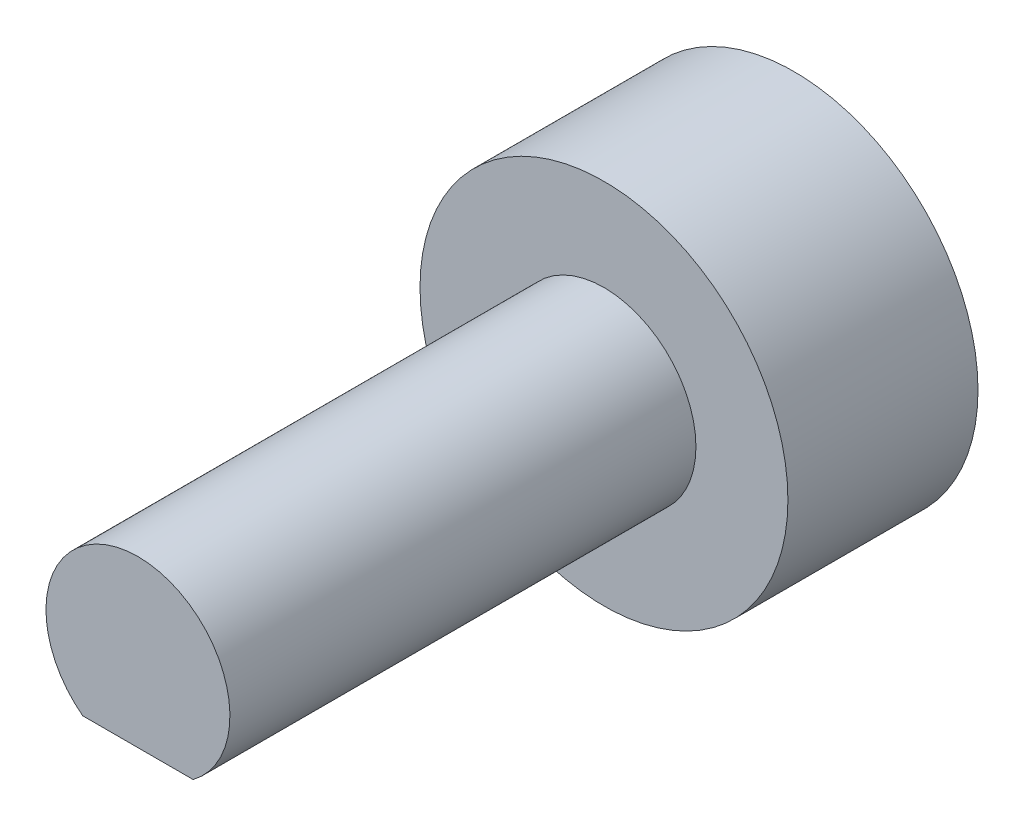
ISO-10303-21;
HEADER;
FILE_DESCRIPTION(('STEP AP214'),'2;1');
FILE_NAME('part.step','',(''),(''),'','','');
FILE_SCHEMA(('AUTOMOTIVE_DESIGN { 1 0 10303 214 1 1 1 1 }'));
ENDSEC;
DATA;
#1=APPLICATION_CONTEXT('core data for automotive mechanical design processes');
#2=APPLICATION_PROTOCOL_DEFINITION('international standard','automotive_design',2000,#1);
#3=PRODUCT_CONTEXT('',#1,'mechanical');
#4=PRODUCT('Part','Part','',(#3));
#5=PRODUCT_RELATED_PRODUCT_CATEGORY('part','',(#4));
#6=PRODUCT_DEFINITION_FORMATION('','',#4);
#7=PRODUCT_DEFINITION_CONTEXT('part definition',#1,'design');
#8=PRODUCT_DEFINITION('design','',#6,#7);
#9=PRODUCT_DEFINITION_SHAPE('','',#8);
#10=(LENGTH_UNIT() NAMED_UNIT(*) SI_UNIT(.MILLI.,.METRE.));
#11=(NAMED_UNIT(*) PLANE_ANGLE_UNIT() SI_UNIT($,.RADIAN.));
#12=(NAMED_UNIT(*) SI_UNIT($,.STERADIAN.) SOLID_ANGLE_UNIT());
#13=UNCERTAINTY_MEASURE_WITH_UNIT(LENGTH_MEASURE(1.E-05),#10,'distance_accuracy_value','');
#14=(GEOMETRIC_REPRESENTATION_CONTEXT(3) GLOBAL_UNCERTAINTY_ASSIGNED_CONTEXT((#13)) GLOBAL_UNIT_ASSIGNED_CONTEXT((#10,
#11,#12)) REPRESENTATION_CONTEXT('',''));
#15=CARTESIAN_POINT('',(0.,0.,0.));
#16=DIRECTION('',(0.,0.,1.));
#17=DIRECTION('',(1.,0.,0.));
#18=AXIS2_PLACEMENT_3D('',#15,#16,#17);
#19=CARTESIAN_POINT('',(0.,0.,15.2));
#20=DIRECTION('',(0.,0.,-1.));
#21=DIRECTION('',(-1.,0.,0.));
#22=AXIS2_PLACEMENT_3D('',#19,#20,#21);
#23=CYLINDRICAL_SURFACE('',#22,3.);
#24=CARTESIAN_POINT('',(0.,0.,0.));
#25=DIRECTION('',(0.,0.,1.));
#26=DIRECTION('',(1.,0.,0.));
#27=AXIS2_PLACEMENT_3D('',#24,#25,#26);
#28=CIRCLE('',#27,3.);
#29=CARTESIAN_POINT('',(3.,0.,0.));
#30=VERTEX_POINT('',#29);
#31=EDGE_CURVE('E11',#30,#30,#28,.T.);
#32=ORIENTED_EDGE('',*,*,#31,.T.);
#33=EDGE_LOOP('',(#32));
#34=FACE_BOUND('',#33,.T.);
#35=DIRECTION('',(0.,0.,-1.));
#36=VECTOR('',#35,1.);
#37=CARTESIAN_POINT('',(-1.8,-2.4,76.0903353820668));
#38=LINE('',#37,#36);
#39=CARTESIAN_POINT('',(-1.8,-2.4,15.2));
#40=VERTEX_POINT('',#39);
#41=CARTESIAN_POINT('',(-1.8,-2.4,3.));
#42=VERTEX_POINT('',#41);
#43=EDGE_CURVE('E67',#40,#42,#38,.T.);
#44=ORIENTED_EDGE('',*,*,#43,.F.);
#45=CARTESIAN_POINT('',(0.,0.,15.2));
#46=DIRECTION('',(0.,0.,1.));
#47=DIRECTION('',(1.,0.,0.));
#48=AXIS2_PLACEMENT_3D('',#45,#46,#47);
#49=CIRCLE('',#48,3.);
#50=CARTESIAN_POINT('',(1.8,-2.4,15.2));
#51=VERTEX_POINT('',#50);
#52=EDGE_CURVE('E78',#51,#40,#49,.T.);
#53=ORIENTED_EDGE('',*,*,#52,.F.);
#54=DIRECTION('',(0.,0.,-1.));
#55=VECTOR('',#54,1.);
#56=CARTESIAN_POINT('',(1.8,-2.4,76.0903353820668));
#57=LINE('',#56,#55);
#58=CARTESIAN_POINT('',(1.8,-2.4,3.));
#59=VERTEX_POINT('',#58);
#60=EDGE_CURVE('E51',#51,#59,#57,.T.);
#61=ORIENTED_EDGE('',*,*,#60,.T.);
#62=CARTESIAN_POINT('',(0.,0.,3.));
#63=DIRECTION('',(0.,0.,1.));
#64=DIRECTION('',(1.,0.,0.));
#65=AXIS2_PLACEMENT_3D('',#62,#63,#64);
#66=CIRCLE('',#65,3.);
#67=EDGE_CURVE('E66',#42,#59,#66,.T.);
#68=ORIENTED_EDGE('',*,*,#67,.F.);
#69=EDGE_LOOP('',(#44,#53,#61,#68));
#70=FACE_BOUND('',#69,.T.);
#71=ADVANCED_FACE('F34',(#34,#70),#23,.T.);
#72=CARTESIAN_POINT('',(0.,0.,15.2));
#73=DIRECTION('',(0.,0.,1.));
#74=DIRECTION('',(1.,0.,0.));
#75=AXIS2_PLACEMENT_3D('',#72,#73,#74);
#76=PLANE('',#75);
#77=ORIENTED_EDGE('',*,*,#52,.T.);
#78=DIRECTION('',(-1.,0.,0.));
#79=VECTOR('',#78,1.);
#80=CARTESIAN_POINT('',(1.8,-2.4,15.2));
#81=LINE('',#80,#79);
#82=EDGE_CURVE('E55',#51,#40,#81,.T.);
#83=ORIENTED_EDGE('',*,*,#82,.F.);
#84=EDGE_LOOP('',(#77,#83));
#85=FACE_BOUND('',#84,.T.);
#86=ADVANCED_FACE('F89',(#85),#76,.T.);
#87=CARTESIAN_POINT('',(0.,0.,-6.2));
#88=DIRECTION('',(0.,0.,1.));
#89=DIRECTION('',(1.,0.,0.));
#90=AXIS2_PLACEMENT_3D('',#87,#88,#89);
#91=CYLINDRICAL_SURFACE('',#90,6.);
#92=CARTESIAN_POINT('',(0.,0.,-6.2));
#93=DIRECTION('',(0.,0.,1.));
#94=DIRECTION('',(1.,0.,0.));
#95=AXIS2_PLACEMENT_3D('',#92,#93,#94);
#96=CIRCLE('',#95,6.);
#97=CARTESIAN_POINT('',(6.,0.,-6.2));
#98=VERTEX_POINT('',#97);
#99=EDGE_CURVE('E43',#98,#98,#96,.T.);
#100=CARTESIAN_POINT('',(0.,0.,0.));
#101=DIRECTION('',(0.,0.,1.));
#102=DIRECTION('',(1.,0.,0.));
#103=AXIS2_PLACEMENT_3D('',#100,#101,#102);
#104=CIRCLE('',#103,6.);
#105=CARTESIAN_POINT('',(6.,0.,0.));
#106=VERTEX_POINT('',#105);
#107=EDGE_CURVE('E38',#106,#106,#104,.T.);
#108=CARTESIAN_POINT('',(6.,0.,-6.2));
#109=CARTESIAN_POINT('',(6.,0.,-6.13541666666667));
#110=CARTESIAN_POINT('',(6.,0.,-6.07083333333333));
#111=CARTESIAN_POINT('',(6.,0.,-5.94166666666667));
#112=CARTESIAN_POINT('',(6.,0.,-5.87708333333333));
#113=CARTESIAN_POINT('',(6.,0.,-5.74791666666667));
#114=CARTESIAN_POINT('',(6.,0.,-5.68333333333333));
#115=CARTESIAN_POINT('',(6.,0.,-5.55416666666667));
#116=CARTESIAN_POINT('',(6.,0.,-5.48958333333333));
#117=CARTESIAN_POINT('',(6.,0.,-5.36041666666667));
#118=CARTESIAN_POINT('',(6.,0.,-5.29583333333333));
#119=CARTESIAN_POINT('',(6.,0.,-5.16666666666667));
#120=CARTESIAN_POINT('',(6.,0.,-5.10208333333333));
#121=CARTESIAN_POINT('',(6.,0.,-4.97291666666667));
#122=CARTESIAN_POINT('',(6.,0.,-4.90833333333333));
#123=CARTESIAN_POINT('',(6.,0.,-4.77916666666667));
#124=CARTESIAN_POINT('',(6.,0.,-4.71458333333333));
#125=CARTESIAN_POINT('',(6.,0.,-4.58541666666667));
#126=CARTESIAN_POINT('',(6.,0.,-4.52083333333333));
#127=CARTESIAN_POINT('',(6.,0.,-4.39166666666667));
#128=CARTESIAN_POINT('',(6.,0.,-4.32708333333333));
#129=CARTESIAN_POINT('',(6.,0.,-4.19791666666667));
#130=CARTESIAN_POINT('',(6.,0.,-4.13333333333333));
#131=CARTESIAN_POINT('',(6.,0.,-4.00416666666667));
#132=CARTESIAN_POINT('',(6.,0.,-3.93958333333333));
#133=CARTESIAN_POINT('',(6.,0.,-3.81041666666667));
#134=CARTESIAN_POINT('',(6.,0.,-3.74583333333333));
#135=CARTESIAN_POINT('',(6.,0.,-3.61666666666667));
#136=CARTESIAN_POINT('',(6.,0.,-3.55208333333333));
#137=CARTESIAN_POINT('',(6.,0.,-3.42291666666667));
#138=CARTESIAN_POINT('',(6.,0.,-3.35833333333333));
#139=CARTESIAN_POINT('',(6.,0.,-3.22916666666667));
#140=CARTESIAN_POINT('',(6.,0.,-3.16458333333333));
#141=CARTESIAN_POINT('',(6.,0.,-3.03541666666667));
#142=CARTESIAN_POINT('',(6.,0.,-2.97083333333333));
#143=CARTESIAN_POINT('',(6.,0.,-2.84166666666667));
#144=CARTESIAN_POINT('',(6.,0.,-2.77708333333333));
#145=CARTESIAN_POINT('',(6.,0.,-2.64791666666667));
#146=CARTESIAN_POINT('',(6.,0.,-2.58333333333333));
#147=CARTESIAN_POINT('',(6.,0.,-2.45416666666667));
#148=CARTESIAN_POINT('',(6.,0.,-2.38958333333333));
#149=CARTESIAN_POINT('',(6.,0.,-2.26041666666667));
#150=CARTESIAN_POINT('',(6.,0.,-2.19583333333333));
#151=CARTESIAN_POINT('',(6.,0.,-2.06666666666667));
#152=CARTESIAN_POINT('',(6.,0.,-2.00208333333333));
#153=CARTESIAN_POINT('',(6.,0.,-1.87291666666667));
#154=CARTESIAN_POINT('',(6.,0.,-1.80833333333333));
#155=CARTESIAN_POINT('',(6.,0.,-1.67916666666667));
#156=CARTESIAN_POINT('',(6.,0.,-1.61458333333333));
#157=CARTESIAN_POINT('',(6.,0.,-1.48541666666667));
#158=CARTESIAN_POINT('',(6.,0.,-1.42083333333333));
#159=CARTESIAN_POINT('',(6.,0.,-1.29166666666667));
#160=CARTESIAN_POINT('',(6.,0.,-1.22708333333333));
#161=CARTESIAN_POINT('',(6.,0.,-1.09791666666667));
#162=CARTESIAN_POINT('',(6.,0.,-1.03333333333333));
#163=CARTESIAN_POINT('',(6.,0.,-0.904166666666667));
#164=CARTESIAN_POINT('',(6.,0.,-0.839583333333334));
#165=CARTESIAN_POINT('',(6.,0.,-0.710416666666667));
#166=CARTESIAN_POINT('',(6.,0.,-0.645833333333334));
#167=CARTESIAN_POINT('',(6.,0.,-0.516666666666667));
#168=CARTESIAN_POINT('',(6.,0.,-0.452083333333333));
#169=CARTESIAN_POINT('',(6.,0.,-0.322916666666667));
#170=CARTESIAN_POINT('',(6.,0.,-0.258333333333334));
#171=CARTESIAN_POINT('',(6.,0.,-0.129166666666667));
#172=CARTESIAN_POINT('',(6.,0.,-0.0645833333333335));
#173=CARTESIAN_POINT('',(6.,0.,0.));
#174=B_SPLINE_CURVE_WITH_KNOTS('',3,(#108,#109,#110,#111,#112,#113,#114,#115,#116,#117,#118,
#119,#120,#121,#122,#123,#124,#125,#126,#127,#128,#129,#130,#131,#132,#133,#134,#135,#136,#137,
#138,#139,#140,#141,#142,#143,#144,#145,#146,#147,#148,#149,#150,#151,#152,#153,#154,#155,#156,
#157,#158,#159,#160,#161,#162,#163,#164,#165,#166,#167,#168,#169,#170,#171,#172,#173),
.UNSPECIFIED.,.F.,.F.,(4,2,2,2,2,2,2,2,2,2,2,2,2,2,2,2,2,2,2,2,2,2,2,2,2,2,2,2,2,2,2,2,4),(0.,
0.19375,0.387500000000001,0.58125,0.775,0.968750000000001,1.1625,1.35625,1.55,1.74375,1.9375,
2.13125,2.325,2.51875,2.7125,2.90625,3.1,3.29375,3.4875,3.68125,3.875,4.06875,4.2625,4.45625,
4.65,4.84375,5.0375,5.23125,5.425,5.61875,5.8125,6.00625,6.2),.UNSPECIFIED.);
#175=EDGE_CURVE('BSEAM36',#98,#106,#174,.T.);
#176=ORIENTED_EDGE('',*,*,#99,.T.);
#177=ORIENTED_EDGE('',*,*,#107,.F.);
#178=ORIENTED_EDGE('',*,*,#175,.T.);
#179=ORIENTED_EDGE('',*,*,#175,.F.);
#180=EDGE_LOOP('',(#176,#178,#177,#179));
#181=FACE_BOUND('',#180,.T.);
#182=ADVANCED_FACE('F36',(#181),#91,.T.);
#183=CARTESIAN_POINT('',(0.,0.,-6.2));
#184=DIRECTION('',(0.,0.,1.));
#185=DIRECTION('',(1.,0.,0.));
#186=AXIS2_PLACEMENT_3D('',#183,#184,#185);
#187=PLANE('',#186);
#188=ORIENTED_EDGE('',*,*,#99,.F.);
#189=EDGE_LOOP('',(#188));
#190=FACE_BOUND('',#189,.T.);
#191=ADVANCED_FACE('F88',(#190),#187,.F.);
#192=CARTESIAN_POINT('',(0.,0.,0.));
#193=DIRECTION('',(0.,0.,1.));
#194=DIRECTION('',(1.,0.,0.));
#195=AXIS2_PLACEMENT_3D('',#192,#193,#194);
#196=PLANE('',#195);
#197=ORIENTED_EDGE('',*,*,#31,.F.);
#198=EDGE_LOOP('',(#197));
#199=FACE_BOUND('',#198,.T.);
#200=ORIENTED_EDGE('',*,*,#107,.T.);
#201=EDGE_LOOP('',(#200));
#202=FACE_BOUND('',#201,.T.);
#203=ADVANCED_FACE('F85',(#199,#202),#196,.T.);
#204=CARTESIAN_POINT('',(1.8,-2.4,76.0903353820668));
#205=DIRECTION('',(0.,-1.,0.));
#206=DIRECTION('',(0.,0.,-1.));
#207=AXIS2_PLACEMENT_3D('',#204,#205,#206);
#208=PLANE('',#207);
#209=ORIENTED_EDGE('',*,*,#60,.F.);
#210=ORIENTED_EDGE('',*,*,#82,.T.);
#211=ORIENTED_EDGE('',*,*,#43,.T.);
#212=DIRECTION('',(-1.,0.,0.));
#213=VECTOR('',#212,1.);
#214=CARTESIAN_POINT('',(1.8,-2.4,3.));
#215=LINE('',#214,#213);
#216=EDGE_CURVE('E63',#59,#42,#215,.T.);
#217=ORIENTED_EDGE('',*,*,#216,.F.);
#218=EDGE_LOOP('',(#209,#210,#211,#217));
#219=FACE_BOUND('',#218,.T.);
#220=ADVANCED_FACE('F69',(#219),#208,.T.);
#221=CARTESIAN_POINT('',(0.,0.,3.));
#222=DIRECTION('',(0.,0.,1.));
#223=DIRECTION('',(1.,0.,0.));
#224=AXIS2_PLACEMENT_3D('',#221,#222,#223);
#225=PLANE('',#224);
#226=ORIENTED_EDGE('',*,*,#216,.T.);
#227=ORIENTED_EDGE('',*,*,#67,.T.);
#228=EDGE_LOOP('',(#226,#227));
#229=FACE_BOUND('',#228,.T.);
#230=ADVANCED_FACE('F64',(#229),#225,.T.);
#231=CLOSED_SHELL('',(#71,#86,#182,#191,#203,#220,#230));
#232=MANIFOLD_SOLID_BREP('B2',#231);
#233=ADVANCED_BREP_SHAPE_REPRESENTATION('',(#18,#232),#14);
#234=SHAPE_DEFINITION_REPRESENTATION(#9,#233);
ENDSEC;
END-ISO-10303-21;
